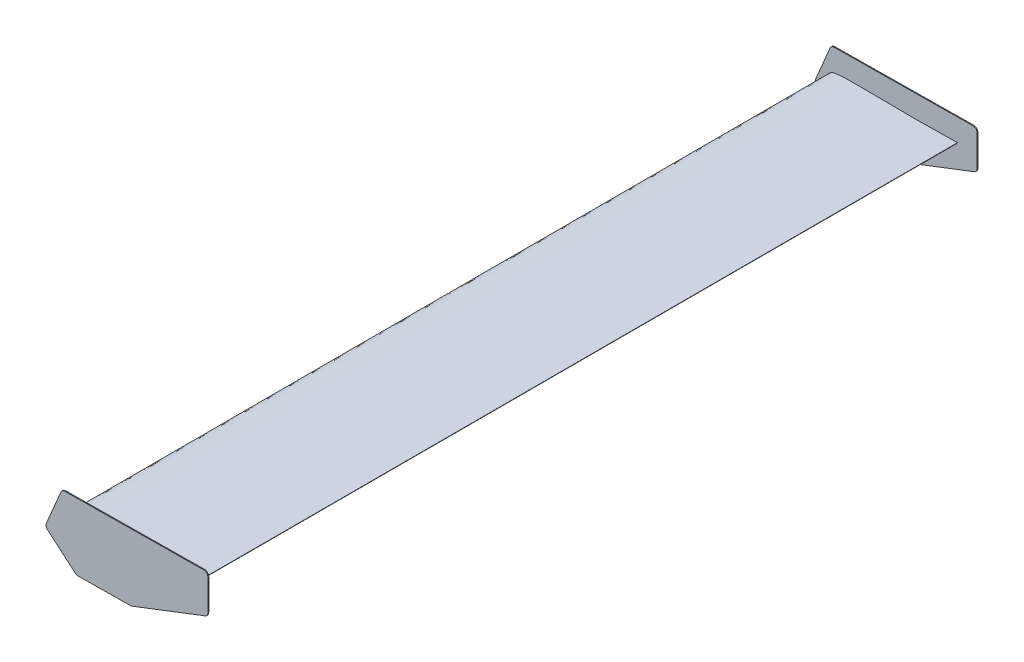
ISO-10303-21;
HEADER;
FILE_DESCRIPTION(('STEP AP214'),'2;1');
FILE_NAME('part.step','',(''),(''),'','','');
FILE_SCHEMA(('AUTOMOTIVE_DESIGN { 1 0 10303 214 1 1 1 1 }'));
ENDSEC;
DATA;
#1=APPLICATION_CONTEXT('core data for automotive mechanical design processes');
#2=APPLICATION_PROTOCOL_DEFINITION('international standard','automotive_design',2000,#1);
#3=PRODUCT_CONTEXT('',#1,'mechanical');
#4=PRODUCT('Part','Part','',(#3));
#5=PRODUCT_RELATED_PRODUCT_CATEGORY('part','',(#4));
#6=PRODUCT_DEFINITION_FORMATION('','',#4);
#7=PRODUCT_DEFINITION_CONTEXT('part definition',#1,'design');
#8=PRODUCT_DEFINITION('design','',#6,#7);
#9=PRODUCT_DEFINITION_SHAPE('','',#8);
#10=(LENGTH_UNIT() NAMED_UNIT(*) SI_UNIT(.MILLI.,.METRE.));
#11=(NAMED_UNIT(*) PLANE_ANGLE_UNIT() SI_UNIT($,.RADIAN.));
#12=(NAMED_UNIT(*) SI_UNIT($,.STERADIAN.) SOLID_ANGLE_UNIT());
#13=UNCERTAINTY_MEASURE_WITH_UNIT(LENGTH_MEASURE(1.E-05),#10,'distance_accuracy_value','');
#14=(GEOMETRIC_REPRESENTATION_CONTEXT(3) GLOBAL_UNCERTAINTY_ASSIGNED_CONTEXT((#13)) GLOBAL_UNIT_ASSIGNED_CONTEXT((#10,
#11,#12)) REPRESENTATION_CONTEXT('',''));
#15=CARTESIAN_POINT('',(0.,0.,0.));
#16=DIRECTION('',(0.,0.,1.));
#17=DIRECTION('',(1.,0.,0.));
#18=AXIS2_PLACEMENT_3D('',#15,#16,#17);
#19=CARTESIAN_POINT('',(0.,0.,899.));
#20=DIRECTION('',(0.,0.,-1.));
#21=DIRECTION('',(-1.,0.,0.));
#22=AXIS2_PLACEMENT_3D('',#19,#20,#21);
#23=PLANE('',#22);
#24=DIRECTION('',(-0.999947428083981,-0.0102538318804609,0.));
#25=VECTOR('',#24,1.);
#26=CARTESIAN_POINT('',(4.19836461655942,59.4066569608688,899.));
#27=LINE('',#26,#25);
#28=CARTESIAN_POINT('',(335.564783335885,62.8046111462092,899.));
#29=VERTEX_POINT('',#28);
#30=CARTESIAN_POINT('',(10.7496298097369,59.4738360644981,899.));
#31=VERTEX_POINT('',#30);
#32=EDGE_CURVE('E235',#29,#31,#27,.T.);
#33=ORIENTED_EDGE('',*,*,#32,.F.);
#34=CARTESIAN_POINT('',(335.667321654689,52.8051368653694,899.));
#35=DIRECTION('',(0.,0.,-1.));
#36=DIRECTION('',(-1.,0.,0.));
#37=AXIS2_PLACEMENT_3D('',#34,#35,#36);
#38=CIRCLE('',#37,10.);
#39=CARTESIAN_POINT('',(345.667321654689,52.8051368653694,899.));
#40=VERTEX_POINT('',#39);
#41=EDGE_CURVE('E262',#29,#40,#38,.T.);
#42=ORIENTED_EDGE('',*,*,#41,.T.);
#43=DIRECTION('',(0.,1.,0.));
#44=VECTOR('',#43,1.);
#45=CARTESIAN_POINT('',(345.667321654689,62.908206321893,899.));
#46=LINE('',#45,#44);
#47=CARTESIAN_POINT('',(345.667321654689,-19.4543841415105,899.));
#48=VERTEX_POINT('',#47);
#49=EDGE_CURVE('E380',#48,#40,#46,.T.);
#50=ORIENTED_EDGE('',*,*,#49,.F.);
#51=CARTESIAN_POINT('',(335.667321654689,-19.4543841415105,899.));
#52=DIRECTION('',(0.,0.,-1.));
#53=DIRECTION('',(-1.,0.,0.));
#54=AXIS2_PLACEMENT_3D('',#51,#52,#53);
#55=CIRCLE('',#54,10.);
#56=CARTESIAN_POINT('',(339.261892028957,-28.7860004979859,899.));
#57=VERTEX_POINT('',#56);
#58=EDGE_CURVE('E260',#48,#57,#55,.T.);
#59=ORIENTED_EDGE('',*,*,#58,.T.);
#60=DIRECTION('',(0.93316163564754,0.35945703742674,0.));
#61=VECTOR('',#60,1.);
#62=CARTESIAN_POINT('',(166.275090380422,-95.4211051348804,899.));
#63=LINE('',#62,#61);
#64=CARTESIAN_POINT('',(167.960784377593,-94.7717700710672,899.));
#65=VERTEX_POINT('',#64);
#66=EDGE_CURVE('E406',#65,#57,#63,.T.);
#67=ORIENTED_EDGE('',*,*,#66,.F.);
#68=CARTESIAN_POINT('',(164.366214003326,-85.4401537145918,899.));
#69=DIRECTION('',(0.,0.,-1.));
#70=DIRECTION('',(-1.,0.,0.));
#71=AXIS2_PLACEMENT_3D('',#68,#69,#70);
#72=CIRCLE('',#71,10.);
#73=CARTESIAN_POINT('',(164.46875232213,-95.4396279954316,899.));
#74=VERTEX_POINT('',#73);
#75=EDGE_CURVE('E258',#65,#74,#72,.T.);
#76=ORIENTED_EDGE('',*,*,#75,.T.);
#77=DIRECTION('',(0.99994742808398,0.010253831880461,0.));
#78=VECTOR('',#77,1.);
#79=CARTESIAN_POINT('',(38.2575012573376,-96.7338449847395,899.));
#80=LINE('',#79,#78);
#81=CARTESIAN_POINT('',(42.0078617050286,-96.6953873974287,899.));
#82=VERTEX_POINT('',#81);
#83=EDGE_CURVE('E403',#82,#74,#80,.T.);
#84=ORIENTED_EDGE('',*,*,#83,.F.);
#85=CARTESIAN_POINT('',(41.905323386224,-86.6959131165889,899.));
#86=DIRECTION('',(0.,0.,-1.));
#87=DIRECTION('',(-1.,0.,0.));
#88=AXIS2_PLACEMENT_3D('',#85,#86,#87);
#89=CIRCLE('',#88,10.);
#90=CARTESIAN_POINT('',(35.4068383285812,-94.2965507185006,899.));
#91=VERTEX_POINT('',#90);
#92=EDGE_CURVE('E252',#82,#91,#89,.T.);
#93=ORIENTED_EDGE('',*,*,#92,.T.);
#94=DIRECTION('',(0.760063760191166,-0.649848505764278,0.));
#95=VECTOR('',#94,1.);
#96=CARTESIAN_POINT('',(-35.2909208199958,-33.8505255955157,899.));
#97=LINE('',#96,#95);
#98=CARTESIAN_POINT('',(-29.7260776200808,-38.6084225348037,899.));
#99=VERTEX_POINT('',#98);
#100=EDGE_CURVE('E400',#99,#91,#97,.T.);
#101=ORIENTED_EDGE('',*,*,#100,.F.);
#102=CARTESIAN_POINT('',(-23.227592562438,-31.007784932892,899.));
#103=DIRECTION('',(0.,0.,-1.));
#104=DIRECTION('',(-1.,0.,0.));
#105=AXIS2_PLACEMENT_3D('',#102,#103,#104);
#106=CIRCLE('',#105,10.);
#107=CARTESIAN_POINT('',(-32.4360484248066,-27.1085105605493,899.));
#108=VERTEX_POINT('',#107);
#109=EDGE_CURVE('E254',#99,#108,#106,.T.);
#110=ORIENTED_EDGE('',*,*,#109,.T.);
#111=DIRECTION('',(-0.38992743723427,-0.920845586236864,0.));
#112=VECTOR('',#111,1.);
#113=CARTESIAN_POINT('',(4.19836461655942,59.4066569608688,899.));
#114=LINE('',#113,#112);
#115=CARTESIAN_POINT('',(1.64371226617284,53.373636156001,899.));
#116=VERTEX_POINT('',#115);
#117=EDGE_CURVE('E397',#116,#108,#114,.T.);
#118=ORIENTED_EDGE('',*,*,#117,.F.);
#119=CARTESIAN_POINT('',(10.8521681285415,49.4743617836583,899.));
#120=DIRECTION('',(0.,0.,-1.));
#121=DIRECTION('',(-1.,0.,0.));
#122=AXIS2_PLACEMENT_3D('',#119,#120,#121);
#123=CIRCLE('',#122,10.);
#124=EDGE_CURVE('E256',#116,#31,#123,.T.);
#125=ORIENTED_EDGE('',*,*,#124,.T.);
#126=EDGE_LOOP('',(#33,#42,#50,#59,#67,#76,#84,#93,#101,#110,#118,#125));
#127=FACE_BOUND('',#126,.T.);
#128=CARTESIAN_POINT('',(299.817501451196,10.4698578577689,899.));
#129=CARTESIAN_POINT('',(294.819493558829,10.3247333266549,899.));
#130=CARTESIAN_POINT('',(284.823207898669,10.034476428196,899.));
#131=CARTESIAN_POINT('',(264.825396651254,9.62450241999933,899.));
#132=CARTESIAN_POINT('',(239.823941693245,9.18232731185009,899.));
#133=CARTESIAN_POINT('',(209.813246030922,8.95797250689968,899.));
#134=CARTESIAN_POINT('',(179.795480369291,9.01543988824321,899.));
#135=CARTESIAN_POINT('',(149.774348493225,9.25845621632941,899.));
#136=CARTESIAN_POINT('',(119.747764534315,9.37676564731784,899.));
#137=CARTESIAN_POINT('',(94.7257174089398,9.73657753304946,899.));
#138=CARTESIAN_POINT('',(74.7055026848703,9.99943048883228,899.));
#139=CARTESIAN_POINT('',(59.694314486879,10.2946297974344,899.));
#140=CARTESIAN_POINT('',(44.6852995562319,10.210119951843,899.));
#141=CARTESIAN_POINT('',(32.1838960242226,9.82488500204351,899.));
#142=CARTESIAN_POINT('',(22.1933600200283,9.02102063681778,899.));
#143=CARTESIAN_POINT('',(14.6887107150029,8.107455225593,899.));
#144=CARTESIAN_POINT('',(8.35908343666014,6.59405140068495,899.));
#145=CARTESIAN_POINT('',(3.07226363202046,4.48936231611118,899.));
#146=CARTESIAN_POINT('',(-2.00742192700509,-0.590375041487433,899.));
#147=CARTESIAN_POINT('',(3.06702174071527,-6.83857075672109,899.));
#148=CARTESIAN_POINT('',(8.78272888026005,-10.6374153518176,899.));
#149=CARTESIAN_POINT('',(15.325277330079,-13.7539263589575,899.));
#150=CARTESIAN_POINT('',(22.9653244495639,-16.5821851820806,899.));
#151=CARTESIAN_POINT('',(33.070045823256,-19.5104386047602,899.));
#152=CARTESIAN_POINT('',(45.6513409483603,-22.3232088429504,899.));
#153=CARTESIAN_POINT('',(60.7931768513638,-24.5046816970978,899.));
#154=CARTESIAN_POINT('',(75.8734683843432,-25.8221406714379,899.));
#155=CARTESIAN_POINT('',(95.9183287044872,-26.5333635126473,899.));
#156=CARTESIAN_POINT('',(120.964329455509,-25.6715114345032,899.));
#157=CARTESIAN_POINT('',(150.901265807137,-22.7048522321919,899.));
#158=CARTESIAN_POINT('',(180.801099732482,-18.5567332890766,899.));
#159=CARTESIAN_POINT('',(210.641802762297,-13.1473547867284,899.));
#160=CARTESIAN_POINT('',(240.473223162505,-6.76904160970051,899.));
#161=CARTESIAN_POINT('',(265.241620881106,-0.483296224805891,899.));
#162=CARTESIAN_POINT('',(285.028566090619,5.11735656510686,899.));
#163=CARTESIAN_POINT('',(294.897371675381,8.16352838072202,899.));
#164=CARTESIAN_POINT('',(299.84370965418,9.69029828333194,899.));
#165=B_SPLINE_CURVE_WITH_KNOTS('',3,(#128,#129,#130,#131,#132,#133,#134,#135,#136,#137,#138,
#139,#140,#141,#142,#143,#144,#145,#146,#147,#148,#149,#150,#151,#152,#153,#154,#155,#156,#157,
#158,#159,#160,#161,#162,#163,#164),.UNSPECIFIED.,.F.,.F.,(4,1,1,1,1,1,1,1,1,1,1,1,1,1,1,1,1,1,
1,1,1,1,1,1,1,1,1,1,1,1,1,1,1,1,4),(0.,0.0244427721061945,0.0488868640389345,0.0977785916589877,
0.146679776180424,0.195594373169575,0.244518129566772,0.293441885963969,0.342378242904188,
0.366848716418896,0.391319189933605,0.415771101598765,0.440213629284816,0.45244886604217,
0.464730985941134,0.477233997408243,0.483852229950494,0.493136970824156,0.506538949171679,
0.514213997148271,0.528080018214651,0.541297784208939,0.554174880744231,0.579429854643616,
0.604273702829676,0.628897262955146,0.653399405638713,0.702284461010814,0.751259990775971,
0.800413393105454,0.849809284276661,0.899479567348494,0.949512346609459,0.974695114289043,1.),.UNSPECIFIED.);
#166=CARTESIAN_POINT('',(299.84370965418,9.69029828333194,899.));
#167=VERTEX_POINT('',#166);
#168=CARTESIAN_POINT('',(299.817501451196,10.4698578577689,899.));
#169=VERTEX_POINT('',#168);
#170=EDGE_CURVE('E244',#167,#169,#165,.F.);
#171=ORIENTED_EDGE('',*,*,#170,.F.);
#172=DIRECTION('',(0.0336002602352447,-0.999435351842291,0.));
#173=VECTOR('',#172,1.);
#174=CARTESIAN_POINT('',(299.817501451196,10.4698578577689,899.));
#175=LINE('',#174,#173);
#176=EDGE_CURVE('E240',#169,#167,#175,.T.);
#177=ORIENTED_EDGE('',*,*,#176,.F.);
#178=EDGE_LOOP('',(#171,#177));
#179=FACE_BOUND('',#178,.T.);
#180=ADVANCED_FACE('F45',(#127,#179),#23,.T.);
#181=CARTESIAN_POINT('',(4.19836461655942,59.4066569608688,901.));
#182=DIRECTION('',(0.0102538318804609,-0.999947428083981,0.));
#183=DIRECTION('',(0.999947428083981,0.0102538318804609,0.));
#184=AXIS2_PLACEMENT_3D('',#181,#182,#183);
#185=PLANE('',#184);
#186=DIRECTION('',(-0.999947428083981,-0.0102538318804609,0.));
#187=VECTOR('',#186,1.);
#188=CARTESIAN_POINT('',(4.19836461655942,59.4066569608688,901.));
#189=LINE('',#188,#187);
#190=CARTESIAN_POINT('',(335.564783335885,62.8046111462092,901.));
#191=VERTEX_POINT('',#190);
#192=CARTESIAN_POINT('',(10.7496298097369,59.4738360644981,901.));
#193=VERTEX_POINT('',#192);
#194=EDGE_CURVE('E373',#191,#193,#189,.T.);
#195=ORIENTED_EDGE('',*,*,#194,.F.);
#196=DIRECTION('',(0.,0.,-1.));
#197=VECTOR('',#196,1.);
#198=CARTESIAN_POINT('',(335.564783335885,62.8046111462092,901.));
#199=LINE('',#198,#197);
#200=EDGE_CURVE('E249',#191,#29,#199,.T.);
#201=ORIENTED_EDGE('',*,*,#200,.T.);
#202=ORIENTED_EDGE('',*,*,#32,.T.);
#203=DIRECTION('',(0.,0.,-1.));
#204=VECTOR('',#203,1.);
#205=CARTESIAN_POINT('',(10.7496298097369,59.4738360644981,901.));
#206=LINE('',#205,#204);
#207=EDGE_CURVE('E242',#31,#193,#206,.F.);
#208=ORIENTED_EDGE('',*,*,#207,.T.);
#209=EDGE_LOOP('',(#195,#201,#202,#208));
#210=FACE_BOUND('',#209,.T.);
#211=ADVANCED_FACE('F475',(#210),#185,.F.);
#212=CARTESIAN_POINT('',(4.19836461655942,59.4066569608688,901.));
#213=DIRECTION('',(0.920845586236864,-0.38992743723427,0.));
#214=DIRECTION('',(0.38992743723427,0.920845586236864,0.));
#215=AXIS2_PLACEMENT_3D('',#212,#213,#214);
#216=PLANE('',#215);
#217=DIRECTION('',(-0.38992743723427,-0.920845586236864,0.));
#218=VECTOR('',#217,1.);
#219=CARTESIAN_POINT('',(4.19836461655942,59.4066569608688,901.));
#220=LINE('',#219,#218);
#221=CARTESIAN_POINT('',(1.64371226617284,53.373636156001,901.));
#222=VERTEX_POINT('',#221);
#223=CARTESIAN_POINT('',(-32.4360484248066,-27.1085105605493,901.));
#224=VERTEX_POINT('',#223);
#225=EDGE_CURVE('E379',#222,#224,#220,.T.);
#226=ORIENTED_EDGE('',*,*,#225,.F.);
#227=DIRECTION('',(0.,0.,-1.));
#228=VECTOR('',#227,1.);
#229=CARTESIAN_POINT('',(1.64371226617284,53.373636156001,901.));
#230=LINE('',#229,#228);
#231=EDGE_CURVE('E293',#222,#116,#230,.T.);
#232=ORIENTED_EDGE('',*,*,#231,.T.);
#233=ORIENTED_EDGE('',*,*,#117,.T.);
#234=DIRECTION('',(0.,0.,-1.));
#235=VECTOR('',#234,1.);
#236=CARTESIAN_POINT('',(-32.4360484248066,-27.1085105605493,901.));
#237=LINE('',#236,#235);
#238=EDGE_CURVE('E291',#108,#224,#237,.F.);
#239=ORIENTED_EDGE('',*,*,#238,.T.);
#240=EDGE_LOOP('',(#226,#232,#233,#239));
#241=FACE_BOUND('',#240,.T.);
#242=ADVANCED_FACE('F481',(#241),#216,.F.);
#243=CARTESIAN_POINT('',(-35.2909208199958,-33.8505255955157,901.));
#244=DIRECTION('',(0.649848505764278,0.760063760191167,0.));
#245=DIRECTION('',(-0.760063760191167,0.649848505764278,0.));
#246=AXIS2_PLACEMENT_3D('',#243,#244,#245);
#247=PLANE('',#246);
#248=DIRECTION('',(0.760063760191166,-0.649848505764278,0.));
#249=VECTOR('',#248,1.);
#250=CARTESIAN_POINT('',(-35.2909208199958,-33.8505255955157,901.));
#251=LINE('',#250,#249);
#252=CARTESIAN_POINT('',(-29.7260776200808,-38.6084225348037,901.));
#253=VERTEX_POINT('',#252);
#254=CARTESIAN_POINT('',(35.4068383285812,-94.2965507185006,901.));
#255=VERTEX_POINT('',#254);
#256=EDGE_CURVE('E383',#253,#255,#251,.T.);
#257=ORIENTED_EDGE('',*,*,#256,.F.);
#258=DIRECTION('',(0.,0.,-1.));
#259=VECTOR('',#258,1.);
#260=CARTESIAN_POINT('',(-29.7260776200808,-38.6084225348037,901.));
#261=LINE('',#260,#259);
#262=EDGE_CURVE('E227',#253,#99,#261,.T.);
#263=ORIENTED_EDGE('',*,*,#262,.T.);
#264=ORIENTED_EDGE('',*,*,#100,.T.);
#265=DIRECTION('',(0.,0.,-1.));
#266=VECTOR('',#265,1.);
#267=CARTESIAN_POINT('',(35.4068383285812,-94.2965507185006,901.));
#268=LINE('',#267,#266);
#269=EDGE_CURVE('E296',#91,#255,#268,.F.);
#270=ORIENTED_EDGE('',*,*,#269,.T.);
#271=EDGE_LOOP('',(#257,#263,#264,#270));
#272=FACE_BOUND('',#271,.T.);
#273=ADVANCED_FACE('F499',(#272),#247,.F.);
#274=CARTESIAN_POINT('',(38.2575012573376,-96.7338449847395,901.));
#275=DIRECTION('',(-0.010253831880461,0.999947428083981,0.));
#276=DIRECTION('',(-0.999947428083981,-0.010253831880461,0.));
#277=AXIS2_PLACEMENT_3D('',#274,#275,#276);
#278=PLANE('',#277);
#279=ORIENTED_EDGE('',*,*,#83,.T.);
#280=DIRECTION('',(0.,0.,-1.));
#281=VECTOR('',#280,1.);
#282=CARTESIAN_POINT('',(164.46875232213,-95.4396279954316,901.));
#283=LINE('',#282,#281);
#284=CARTESIAN_POINT('',(164.46875232213,-95.4396279954316,901.));
#285=VERTEX_POINT('',#284);
#286=EDGE_CURVE('E289',#74,#285,#283,.F.);
#287=ORIENTED_EDGE('',*,*,#286,.T.);
#288=DIRECTION('',(0.99994742808398,0.010253831880461,0.));
#289=VECTOR('',#288,1.);
#290=CARTESIAN_POINT('',(38.2575012573376,-96.7338449847395,901.));
#291=LINE('',#290,#289);
#292=CARTESIAN_POINT('',(42.0078617050286,-96.6953873974287,901.));
#293=VERTEX_POINT('',#292);
#294=EDGE_CURVE('E386',#293,#285,#291,.T.);
#295=ORIENTED_EDGE('',*,*,#294,.F.);
#296=DIRECTION('',(0.,0.,-1.));
#297=VECTOR('',#296,1.);
#298=CARTESIAN_POINT('',(42.0078617050286,-96.6953873974287,901.));
#299=LINE('',#298,#297);
#300=EDGE_CURVE('E286',#293,#82,#299,.T.);
#301=ORIENTED_EDGE('',*,*,#300,.T.);
#302=EDGE_LOOP('',(#279,#287,#295,#301));
#303=FACE_BOUND('',#302,.T.);
#304=ADVANCED_FACE('F495',(#303),#278,.F.);
#305=CARTESIAN_POINT('',(166.275090380422,-95.4211051348804,901.));
#306=DIRECTION('',(-0.359457037426739,0.93316163564754,0.));
#307=DIRECTION('',(-0.93316163564754,-0.35945703742674,0.));
#308=AXIS2_PLACEMENT_3D('',#305,#306,#307);
#309=PLANE('',#308);
#310=ORIENTED_EDGE('',*,*,#66,.T.);
#311=DIRECTION('',(0.,0.,-1.));
#312=VECTOR('',#311,1.);
#313=CARTESIAN_POINT('',(339.261892028957,-28.7860004979859,901.));
#314=LINE('',#313,#312);
#315=CARTESIAN_POINT('',(339.261892028957,-28.7860004979859,901.));
#316=VERTEX_POINT('',#315);
#317=EDGE_CURVE('E284',#57,#316,#314,.F.);
#318=ORIENTED_EDGE('',*,*,#317,.T.);
#319=DIRECTION('',(0.93316163564754,0.35945703742674,0.));
#320=VECTOR('',#319,1.);
#321=CARTESIAN_POINT('',(166.275090380422,-95.4211051348804,901.));
#322=LINE('',#321,#320);
#323=CARTESIAN_POINT('',(167.960784377593,-94.7717700710672,901.));
#324=VERTEX_POINT('',#323);
#325=EDGE_CURVE('E389',#324,#316,#322,.T.);
#326=ORIENTED_EDGE('',*,*,#325,.F.);
#327=DIRECTION('',(0.,0.,-1.));
#328=VECTOR('',#327,1.);
#329=CARTESIAN_POINT('',(167.960784377593,-94.7717700710672,901.));
#330=LINE('',#329,#328);
#331=EDGE_CURVE('E281',#324,#65,#330,.T.);
#332=ORIENTED_EDGE('',*,*,#331,.T.);
#333=EDGE_LOOP('',(#310,#318,#326,#332));
#334=FACE_BOUND('',#333,.T.);
#335=ADVANCED_FACE('F491',(#334),#309,.F.);
#336=CARTESIAN_POINT('',(345.667321654689,62.908206321893,901.));
#337=DIRECTION('',(-1.,0.,0.));
#338=DIRECTION('',(0.,0.,1.));
#339=AXIS2_PLACEMENT_3D('',#336,#337,#338);
#340=PLANE('',#339);
#341=ORIENTED_EDGE('',*,*,#49,.T.);
#342=DIRECTION('',(0.,0.,-1.));
#343=VECTOR('',#342,1.);
#344=CARTESIAN_POINT('',(345.667321654689,52.8051368653694,901.));
#345=LINE('',#344,#343);
#346=CARTESIAN_POINT('',(345.667321654689,52.8051368653694,901.));
#347=VERTEX_POINT('',#346);
#348=EDGE_CURVE('E267',#40,#347,#345,.F.);
#349=ORIENTED_EDGE('',*,*,#348,.T.);
#350=DIRECTION('',(0.,1.,0.));
#351=VECTOR('',#350,1.);
#352=CARTESIAN_POINT('',(345.667321654689,62.908206321893,901.));
#353=LINE('',#352,#351);
#354=CARTESIAN_POINT('',(345.667321654689,-19.4543841415105,901.));
#355=VERTEX_POINT('',#354);
#356=EDGE_CURVE('E392',#355,#347,#353,.T.);
#357=ORIENTED_EDGE('',*,*,#356,.F.);
#358=DIRECTION('',(0.,0.,-1.));
#359=VECTOR('',#358,1.);
#360=CARTESIAN_POINT('',(345.667321654689,-19.4543841415105,901.));
#361=LINE('',#360,#359);
#362=EDGE_CURVE('E264',#355,#48,#361,.T.);
#363=ORIENTED_EDGE('',*,*,#362,.T.);
#364=EDGE_LOOP('',(#341,#349,#357,#363));
#365=FACE_BOUND('',#364,.T.);
#366=ADVANCED_FACE('F488',(#365),#340,.F.);
#367=CARTESIAN_POINT('',(0.,0.,901.));
#368=DIRECTION('',(0.,0.,-1.));
#369=DIRECTION('',(-1.,0.,0.));
#370=AXIS2_PLACEMENT_3D('',#367,#368,#369);
#371=PLANE('',#370);
#372=ORIENTED_EDGE('',*,*,#356,.T.);
#373=CARTESIAN_POINT('',(335.667321654689,52.8051368653694,901.));
#374=DIRECTION('',(0.,0.,-1.));
#375=DIRECTION('',(-1.,0.,0.));
#376=AXIS2_PLACEMENT_3D('',#373,#374,#375);
#377=CIRCLE('',#376,10.);
#378=EDGE_CURVE('E279',#347,#191,#377,.F.);
#379=ORIENTED_EDGE('',*,*,#378,.T.);
#380=ORIENTED_EDGE('',*,*,#194,.T.);
#381=CARTESIAN_POINT('',(10.8521681285415,49.4743617836583,901.));
#382=DIRECTION('',(0.,0.,-1.));
#383=DIRECTION('',(-1.,0.,0.));
#384=AXIS2_PLACEMENT_3D('',#381,#382,#383);
#385=CIRCLE('',#384,10.);
#386=EDGE_CURVE('E273',#193,#222,#385,.F.);
#387=ORIENTED_EDGE('',*,*,#386,.T.);
#388=ORIENTED_EDGE('',*,*,#225,.T.);
#389=CARTESIAN_POINT('',(-23.227592562438,-31.007784932892,901.));
#390=DIRECTION('',(0.,0.,-1.));
#391=DIRECTION('',(-1.,0.,0.));
#392=AXIS2_PLACEMENT_3D('',#389,#390,#391);
#393=CIRCLE('',#392,10.);
#394=EDGE_CURVE('E271',#224,#253,#393,.F.);
#395=ORIENTED_EDGE('',*,*,#394,.T.);
#396=ORIENTED_EDGE('',*,*,#256,.T.);
#397=CARTESIAN_POINT('',(41.905323386224,-86.6959131165889,901.));
#398=DIRECTION('',(0.,0.,-1.));
#399=DIRECTION('',(-1.,0.,0.));
#400=AXIS2_PLACEMENT_3D('',#397,#398,#399);
#401=CIRCLE('',#400,10.);
#402=EDGE_CURVE('E269',#255,#293,#401,.F.);
#403=ORIENTED_EDGE('',*,*,#402,.T.);
#404=ORIENTED_EDGE('',*,*,#294,.T.);
#405=CARTESIAN_POINT('',(164.366214003326,-85.4401537145918,901.));
#406=DIRECTION('',(0.,0.,-1.));
#407=DIRECTION('',(-1.,0.,0.));
#408=AXIS2_PLACEMENT_3D('',#405,#406,#407);
#409=CIRCLE('',#408,10.);
#410=EDGE_CURVE('E275',#285,#324,#409,.F.);
#411=ORIENTED_EDGE('',*,*,#410,.T.);
#412=ORIENTED_EDGE('',*,*,#325,.T.);
#413=CARTESIAN_POINT('',(335.667321654689,-19.4543841415105,901.));
#414=DIRECTION('',(0.,0.,-1.));
#415=DIRECTION('',(-1.,0.,0.));
#416=AXIS2_PLACEMENT_3D('',#413,#414,#415);
#417=CIRCLE('',#416,10.);
#418=EDGE_CURVE('E277',#316,#355,#417,.F.);
#419=ORIENTED_EDGE('',*,*,#418,.T.);
#420=EDGE_LOOP('',(#372,#379,#380,#387,#388,#395,#396,#403,#404,#411,#412,#419));
#421=FACE_BOUND('',#420,.T.);
#422=ADVANCED_FACE('F426',(#421),#371,.F.);
#423=CARTESIAN_POINT('',(299.817501451196,10.4698578577689,900.));
#424=CARTESIAN_POINT('',(294.819493558829,10.3247333266549,900.));
#425=CARTESIAN_POINT('',(284.823207898669,10.034476428196,900.));
#426=CARTESIAN_POINT('',(264.825396651254,9.62450241999933,900.));
#427=CARTESIAN_POINT('',(239.823941693245,9.18232731185009,900.));
#428=CARTESIAN_POINT('',(209.813246030922,8.95797250689968,900.));
#429=CARTESIAN_POINT('',(179.795480369291,9.01543988824321,900.));
#430=CARTESIAN_POINT('',(149.774348493225,9.25845621632941,900.));
#431=CARTESIAN_POINT('',(119.747764534315,9.37676564731784,900.));
#432=CARTESIAN_POINT('',(94.7257174089398,9.73657753304946,900.));
#433=CARTESIAN_POINT('',(74.7055026848703,9.99943048883228,900.));
#434=CARTESIAN_POINT('',(59.694314486879,10.2946297974344,900.));
#435=CARTESIAN_POINT('',(44.6852995562319,10.210119951843,900.));
#436=CARTESIAN_POINT('',(32.1838960242226,9.82488500204351,900.));
#437=CARTESIAN_POINT('',(22.1933600200283,9.02102063681778,900.));
#438=CARTESIAN_POINT('',(14.6887107150029,8.107455225593,900.));
#439=CARTESIAN_POINT('',(8.35908343666014,6.59405140068495,900.));
#440=CARTESIAN_POINT('',(3.07226363202046,4.48936231611118,900.));
#441=CARTESIAN_POINT('',(-2.00742192700509,-0.590375041487433,900.));
#442=CARTESIAN_POINT('',(3.06702174071527,-6.83857075672109,900.));
#443=CARTESIAN_POINT('',(8.78272888026005,-10.6374153518176,900.));
#444=CARTESIAN_POINT('',(15.325277330079,-13.7539263589575,900.));
#445=CARTESIAN_POINT('',(22.9653244495639,-16.5821851820806,900.));
#446=CARTESIAN_POINT('',(33.070045823256,-19.5104386047602,900.));
#447=CARTESIAN_POINT('',(45.6513409483603,-22.3232088429504,900.));
#448=CARTESIAN_POINT('',(60.7931768513638,-24.5046816970978,900.));
#449=CARTESIAN_POINT('',(75.8734683843432,-25.8221406714379,900.));
#450=CARTESIAN_POINT('',(95.9183287044872,-26.5333635126473,900.));
#451=CARTESIAN_POINT('',(120.964329455509,-25.6715114345032,900.));
#452=CARTESIAN_POINT('',(150.901265807137,-22.7048522321919,900.));
#453=CARTESIAN_POINT('',(180.801099732482,-18.5567332890766,900.));
#454=CARTESIAN_POINT('',(210.641802762297,-13.1473547867284,900.));
#455=CARTESIAN_POINT('',(240.473223162505,-6.76904160970051,900.));
#456=CARTESIAN_POINT('',(265.241620881106,-0.483296224805891,900.));
#457=CARTESIAN_POINT('',(285.028566090619,5.11735656510686,900.));
#458=CARTESIAN_POINT('',(294.897371675381,8.16352838072202,900.));
#459=CARTESIAN_POINT('',(299.84370965418,9.69029828333194,900.));
#460=B_SPLINE_CURVE_WITH_KNOTS('',3,(#423,#424,#425,#426,#427,#428,#429,#430,#431,#432,#433,
#434,#435,#436,#437,#438,#439,#440,#441,#442,#443,#444,#445,#446,#447,#448,#449,#450,#451,#452,
#453,#454,#455,#456,#457,#458,#459),.UNSPECIFIED.,.F.,.F.,(4,1,1,1,1,1,1,1,1,1,1,1,1,1,1,1,1,1,
1,1,1,1,1,1,1,1,1,1,1,1,1,1,1,1,4),(0.,0.0244427721061945,0.0488868640389345,0.0977785916589877,
0.146679776180424,0.195594373169575,0.244518129566772,0.293441885963969,0.342378242904188,
0.366848716418896,0.391319189933605,0.415771101598765,0.440213629284816,0.45244886604217,
0.464730985941134,0.477233997408243,0.483852229950494,0.493136970824156,0.506538949171679,
0.514213997148271,0.528080018214651,0.541297784208939,0.554174880744231,0.579429854643616,
0.604273702829676,0.628897262955146,0.653399405638713,0.702284461010814,0.751259990775971,
0.800413393105454,0.849809284276661,0.899479567348494,0.949512346609459,0.974695114289043,1.),.UNSPECIFIED.);
#461=DIRECTION('',(0.,0.,-1.));
#462=VECTOR('',#461,1.);
#463=SURFACE_OF_LINEAR_EXTRUSION('',#460,#462);
#464=DIRECTION('',(0.,0.,-1.));
#465=VECTOR('',#464,1.);
#466=CARTESIAN_POINT('',(299.817501451196,10.4698578577689,900.));
#467=LINE('',#466,#465);
#468=CARTESIAN_POINT('',(299.817501451196,10.4698578577689,-899.));
#469=VERTEX_POINT('',#468);
#470=EDGE_CURVE('E234',#169,#469,#467,.T.);
#471=ORIENTED_EDGE('',*,*,#470,.T.);
#472=CARTESIAN_POINT('',(299.817501451196,10.4698578577689,-899.));
#473=CARTESIAN_POINT('',(294.819493558829,10.3247333266549,-899.));
#474=CARTESIAN_POINT('',(284.823207898669,10.034476428196,-899.));
#475=CARTESIAN_POINT('',(264.825396651254,9.62450241999933,-899.));
#476=CARTESIAN_POINT('',(239.823941693245,9.18232731185009,-899.));
#477=CARTESIAN_POINT('',(209.813246030922,8.95797250689968,-899.));
#478=CARTESIAN_POINT('',(179.795480369291,9.01543988824321,-899.));
#479=CARTESIAN_POINT('',(149.774348493225,9.25845621632941,-899.));
#480=CARTESIAN_POINT('',(119.747764534315,9.37676564731784,-899.));
#481=CARTESIAN_POINT('',(94.7257174089398,9.73657753304946,-899.));
#482=CARTESIAN_POINT('',(74.7055026848703,9.99943048883228,-899.));
#483=CARTESIAN_POINT('',(59.694314486879,10.2946297974344,-899.));
#484=CARTESIAN_POINT('',(44.6852995562319,10.210119951843,-899.));
#485=CARTESIAN_POINT('',(32.1838960242226,9.82488500204351,-899.));
#486=CARTESIAN_POINT('',(22.1933600200283,9.02102063681778,-899.));
#487=CARTESIAN_POINT('',(14.6887107150029,8.107455225593,-899.));
#488=CARTESIAN_POINT('',(8.35908343666014,6.59405140068495,-899.));
#489=CARTESIAN_POINT('',(3.07226363202046,4.48936231611118,-899.));
#490=CARTESIAN_POINT('',(-2.00742192700509,-0.590375041487433,-899.));
#491=CARTESIAN_POINT('',(3.06702174071527,-6.83857075672109,-899.));
#492=CARTESIAN_POINT('',(8.78272888026005,-10.6374153518176,-899.));
#493=CARTESIAN_POINT('',(15.325277330079,-13.7539263589575,-899.));
#494=CARTESIAN_POINT('',(22.9653244495639,-16.5821851820806,-899.));
#495=CARTESIAN_POINT('',(33.070045823256,-19.5104386047602,-899.));
#496=CARTESIAN_POINT('',(45.6513409483603,-22.3232088429504,-899.));
#497=CARTESIAN_POINT('',(60.7931768513638,-24.5046816970978,-899.));
#498=CARTESIAN_POINT('',(75.8734683843432,-25.8221406714379,-899.));
#499=CARTESIAN_POINT('',(95.9183287044872,-26.5333635126473,-899.));
#500=CARTESIAN_POINT('',(120.964329455509,-25.6715114345032,-899.));
#501=CARTESIAN_POINT('',(150.901265807137,-22.7048522321919,-899.));
#502=CARTESIAN_POINT('',(180.801099732482,-18.5567332890766,-899.));
#503=CARTESIAN_POINT('',(210.641802762297,-13.1473547867284,-899.));
#504=CARTESIAN_POINT('',(240.473223162505,-6.76904160970051,-899.));
#505=CARTESIAN_POINT('',(265.241620881106,-0.483296224805891,-899.));
#506=CARTESIAN_POINT('',(285.028566090619,5.11735656510686,-899.));
#507=CARTESIAN_POINT('',(294.897371675381,8.16352838072202,-899.));
#508=CARTESIAN_POINT('',(299.84370965418,9.69029828333194,-899.));
#509=B_SPLINE_CURVE_WITH_KNOTS('',3,(#472,#473,#474,#475,#476,#477,#478,#479,#480,#481,#482,
#483,#484,#485,#486,#487,#488,#489,#490,#491,#492,#493,#494,#495,#496,#497,#498,#499,#500,#501,
#502,#503,#504,#505,#506,#507,#508),.UNSPECIFIED.,.F.,.F.,(4,1,1,1,1,1,1,1,1,1,1,1,1,1,1,1,1,1,
1,1,1,1,1,1,1,1,1,1,1,1,1,1,1,1,4),(0.,0.0244427721061945,0.0488868640389345,0.0977785916589877,
0.146679776180424,0.195594373169575,0.244518129566772,0.293441885963969,0.342378242904188,
0.366848716418896,0.391319189933605,0.415771101598765,0.440213629284816,0.45244886604217,
0.464730985941134,0.477233997408243,0.483852229950494,0.493136970824156,0.506538949171679,
0.514213997148271,0.528080018214651,0.541297784208939,0.554174880744231,0.579429854643616,
0.604273702829676,0.628897262955146,0.653399405638713,0.702284461010814,0.751259990775971,
0.800413393105454,0.849809284276661,0.899479567348494,0.949512346609459,0.974695114289043,1.),.UNSPECIFIED.);
#510=CARTESIAN_POINT('',(299.84370965418,9.69029828333194,-899.));
#511=VERTEX_POINT('',#510);
#512=EDGE_CURVE('E221',#469,#511,#509,.T.);
#513=ORIENTED_EDGE('',*,*,#512,.T.);
#514=DIRECTION('',(0.,0.,-1.));
#515=VECTOR('',#514,1.);
#516=CARTESIAN_POINT('',(299.84370965418,9.69029828333194,900.));
#517=LINE('',#516,#515);
#518=EDGE_CURVE('E233',#167,#511,#517,.T.);
#519=ORIENTED_EDGE('',*,*,#518,.F.);
#520=ORIENTED_EDGE('',*,*,#170,.T.);
#521=EDGE_LOOP('',(#471,#513,#519,#520));
#522=FACE_BOUND('',#521,.T.);
#523=ADVANCED_FACE('F231',(#522),#463,.F.);
#524=CARTESIAN_POINT('',(299.817501451196,10.4698578577689,900.));
#525=DIRECTION('',(-0.999435351842291,-0.0336002602352447,0.));
#526=DIRECTION('',(0.0336002602352447,-0.999435351842291,0.));
#527=AXIS2_PLACEMENT_3D('',#524,#525,#526);
#528=PLANE('',#527);
#529=ORIENTED_EDGE('',*,*,#518,.T.);
#530=DIRECTION('',(-0.0336002602352447,0.999435351842291,0.));
#531=VECTOR('',#530,1.);
#532=CARTESIAN_POINT('',(299.817501451196,10.4698578577689,-899.));
#533=LINE('',#532,#531);
#534=EDGE_CURVE('E218',#511,#469,#533,.T.);
#535=ORIENTED_EDGE('',*,*,#534,.T.);
#536=ORIENTED_EDGE('',*,*,#470,.F.);
#537=ORIENTED_EDGE('',*,*,#176,.T.);
#538=EDGE_LOOP('',(#529,#535,#536,#537));
#539=FACE_BOUND('',#538,.T.);
#540=ADVANCED_FACE('F239',(#539),#528,.F.);
#541=CARTESIAN_POINT('',(335.667321654689,52.8051368653694,901.));
#542=DIRECTION('',(0.,0.,-1.));
#543=DIRECTION('',(-1.,0.,0.));
#544=AXIS2_PLACEMENT_3D('',#541,#542,#543);
#545=CYLINDRICAL_SURFACE('',#544,10.);
#546=ORIENTED_EDGE('',*,*,#378,.F.);
#547=ORIENTED_EDGE('',*,*,#348,.F.);
#548=ORIENTED_EDGE('',*,*,#41,.F.);
#549=ORIENTED_EDGE('',*,*,#200,.F.);
#550=EDGE_LOOP('',(#546,#547,#548,#549));
#551=FACE_BOUND('',#550,.T.);
#552=ADVANCED_FACE('F428',(#551),#545,.T.);
#553=CARTESIAN_POINT('',(335.667321654689,-19.4543841415105,901.));
#554=DIRECTION('',(0.,0.,-1.));
#555=DIRECTION('',(-1.,0.,0.));
#556=AXIS2_PLACEMENT_3D('',#553,#554,#555);
#557=CYLINDRICAL_SURFACE('',#556,10.);
#558=ORIENTED_EDGE('',*,*,#418,.F.);
#559=ORIENTED_EDGE('',*,*,#317,.F.);
#560=ORIENTED_EDGE('',*,*,#58,.F.);
#561=ORIENTED_EDGE('',*,*,#362,.F.);
#562=EDGE_LOOP('',(#558,#559,#560,#561));
#563=FACE_BOUND('',#562,.T.);
#564=ADVANCED_FACE('F431',(#563),#557,.T.);
#565=CARTESIAN_POINT('',(164.366214003326,-85.4401537145918,901.));
#566=DIRECTION('',(0.,0.,-1.));
#567=DIRECTION('',(-1.,0.,0.));
#568=AXIS2_PLACEMENT_3D('',#565,#566,#567);
#569=CYLINDRICAL_SURFACE('',#568,10.);
#570=ORIENTED_EDGE('',*,*,#410,.F.);
#571=ORIENTED_EDGE('',*,*,#286,.F.);
#572=ORIENTED_EDGE('',*,*,#75,.F.);
#573=ORIENTED_EDGE('',*,*,#331,.F.);
#574=EDGE_LOOP('',(#570,#571,#572,#573));
#575=FACE_BOUND('',#574,.T.);
#576=ADVANCED_FACE('F435',(#575),#569,.T.);
#577=CARTESIAN_POINT('',(10.8521681285415,49.4743617836583,901.));
#578=DIRECTION('',(0.,0.,-1.));
#579=DIRECTION('',(-1.,0.,0.));
#580=AXIS2_PLACEMENT_3D('',#577,#578,#579);
#581=CYLINDRICAL_SURFACE('',#580,10.);
#582=ORIENTED_EDGE('',*,*,#386,.F.);
#583=ORIENTED_EDGE('',*,*,#207,.F.);
#584=ORIENTED_EDGE('',*,*,#124,.F.);
#585=ORIENTED_EDGE('',*,*,#231,.F.);
#586=EDGE_LOOP('',(#582,#583,#584,#585));
#587=FACE_BOUND('',#586,.T.);
#588=ADVANCED_FACE('F439',(#587),#581,.T.);
#589=CARTESIAN_POINT('',(-23.227592562438,-31.007784932892,901.));
#590=DIRECTION('',(0.,0.,-1.));
#591=DIRECTION('',(-1.,0.,0.));
#592=AXIS2_PLACEMENT_3D('',#589,#590,#591);
#593=CYLINDRICAL_SURFACE('',#592,10.);
#594=ORIENTED_EDGE('',*,*,#394,.F.);
#595=ORIENTED_EDGE('',*,*,#238,.F.);
#596=ORIENTED_EDGE('',*,*,#109,.F.);
#597=ORIENTED_EDGE('',*,*,#262,.F.);
#598=EDGE_LOOP('',(#594,#595,#596,#597));
#599=FACE_BOUND('',#598,.T.);
#600=ADVANCED_FACE('F443',(#599),#593,.T.);
#601=CARTESIAN_POINT('',(41.905323386224,-86.6959131165889,901.));
#602=DIRECTION('',(0.,0.,-1.));
#603=DIRECTION('',(-1.,0.,0.));
#604=AXIS2_PLACEMENT_3D('',#601,#602,#603);
#605=CYLINDRICAL_SURFACE('',#604,10.);
#606=ORIENTED_EDGE('',*,*,#402,.F.);
#607=ORIENTED_EDGE('',*,*,#269,.F.);
#608=ORIENTED_EDGE('',*,*,#92,.F.);
#609=ORIENTED_EDGE('',*,*,#300,.F.);
#610=EDGE_LOOP('',(#606,#607,#608,#609));
#611=FACE_BOUND('',#610,.T.);
#612=ADVANCED_FACE('F447',(#611),#605,.T.);
#613=CARTESIAN_POINT('',(0.,0.,-899.));
#614=DIRECTION('',(0.,0.,1.));
#615=DIRECTION('',(-1.,0.,0.));
#616=AXIS2_PLACEMENT_3D('',#613,#614,#615);
#617=PLANE('',#616);
#618=DIRECTION('',(0.,1.,0.));
#619=VECTOR('',#618,1.);
#620=CARTESIAN_POINT('',(345.667321654689,62.908206321893,-899.));
#621=LINE('',#620,#619);
#622=CARTESIAN_POINT('',(345.667321654689,-19.4543841415105,-899.));
#623=VERTEX_POINT('',#622);
#624=CARTESIAN_POINT('',(345.667321654689,52.8051368653694,-899.));
#625=VERTEX_POINT('',#624);
#626=EDGE_CURVE('E750',#623,#625,#621,.T.);
#627=ORIENTED_EDGE('',*,*,#626,.T.);
#628=CARTESIAN_POINT('',(335.667321654689,52.8051368653694,-899.));
#629=DIRECTION('',(0.,0.,1.));
#630=DIRECTION('',(1.,0.,0.));
#631=AXIS2_PLACEMENT_3D('',#628,#629,#630);
#632=CIRCLE('',#631,10.);
#633=CARTESIAN_POINT('',(335.564783335885,62.8046111462092,-899.));
#634=VERTEX_POINT('',#633);
#635=EDGE_CURVE('E314',#625,#634,#632,.T.);
#636=ORIENTED_EDGE('',*,*,#635,.T.);
#637=DIRECTION('',(-0.999947428083981,-0.0102538318804609,0.));
#638=VECTOR('',#637,1.);
#639=CARTESIAN_POINT('',(4.19836461655942,59.4066569608688,-899.));
#640=LINE('',#639,#638);
#641=CARTESIAN_POINT('',(10.7496298097369,59.4738360644981,-899.));
#642=VERTEX_POINT('',#641);
#643=EDGE_CURVE('E755',#634,#642,#640,.T.);
#644=ORIENTED_EDGE('',*,*,#643,.T.);
#645=CARTESIAN_POINT('',(10.8521681285415,49.4743617836583,-899.));
#646=DIRECTION('',(0.,0.,1.));
#647=DIRECTION('',(1.,0.,0.));
#648=AXIS2_PLACEMENT_3D('',#645,#646,#647);
#649=CIRCLE('',#648,10.);
#650=CARTESIAN_POINT('',(1.64371226617284,53.373636156001,-899.));
#651=VERTEX_POINT('',#650);
#652=EDGE_CURVE('E308',#642,#651,#649,.T.);
#653=ORIENTED_EDGE('',*,*,#652,.T.);
#654=DIRECTION('',(-0.38992743723427,-0.920845586236864,0.));
#655=VECTOR('',#654,1.);
#656=CARTESIAN_POINT('',(4.19836461655942,59.4066569608688,-899.));
#657=LINE('',#656,#655);
#658=CARTESIAN_POINT('',(-32.4360484248066,-27.1085105605493,-899.));
#659=VERTEX_POINT('',#658);
#660=EDGE_CURVE('E362',#651,#659,#657,.T.);
#661=ORIENTED_EDGE('',*,*,#660,.T.);
#662=CARTESIAN_POINT('',(-23.227592562438,-31.0077849328921,-899.));
#663=DIRECTION('',(0.,0.,1.));
#664=DIRECTION('',(1.,0.,0.));
#665=AXIS2_PLACEMENT_3D('',#662,#663,#664);
#666=CIRCLE('',#665,10.);
#667=CARTESIAN_POINT('',(-29.7260776200808,-38.6084225348037,-899.));
#668=VERTEX_POINT('',#667);
#669=EDGE_CURVE('E306',#659,#668,#666,.T.);
#670=ORIENTED_EDGE('',*,*,#669,.T.);
#671=DIRECTION('',(0.760063760191166,-0.649848505764278,0.));
#672=VECTOR('',#671,1.);
#673=CARTESIAN_POINT('',(-35.2909208199958,-33.8505255955157,-899.));
#674=LINE('',#673,#672);
#675=CARTESIAN_POINT('',(35.4068383285812,-94.2965507185006,-899.));
#676=VERTEX_POINT('',#675);
#677=EDGE_CURVE('E352',#668,#676,#674,.T.);
#678=ORIENTED_EDGE('',*,*,#677,.T.);
#679=CARTESIAN_POINT('',(41.905323386224,-86.6959131165889,-899.));
#680=DIRECTION('',(0.,0.,1.));
#681=DIRECTION('',(1.,0.,0.));
#682=AXIS2_PLACEMENT_3D('',#679,#680,#681);
#683=CIRCLE('',#682,10.);
#684=CARTESIAN_POINT('',(42.0078617050286,-96.6953873974287,-899.));
#685=VERTEX_POINT('',#684);
#686=EDGE_CURVE('E304',#676,#685,#683,.T.);
#687=ORIENTED_EDGE('',*,*,#686,.T.);
#688=DIRECTION('',(0.99994742808398,0.010253831880461,0.));
#689=VECTOR('',#688,1.);
#690=CARTESIAN_POINT('',(38.2575012573376,-96.7338449847395,-899.));
#691=LINE('',#690,#689);
#692=CARTESIAN_POINT('',(164.46875232213,-95.4396279954316,-899.));
#693=VERTEX_POINT('',#692);
#694=EDGE_CURVE('E363',#685,#693,#691,.T.);
#695=ORIENTED_EDGE('',*,*,#694,.T.);
#696=CARTESIAN_POINT('',(164.366214003326,-85.4401537145918,-899.));
#697=DIRECTION('',(0.,0.,1.));
#698=DIRECTION('',(1.,0.,0.));
#699=AXIS2_PLACEMENT_3D('',#696,#697,#698);
#700=CIRCLE('',#699,10.);
#701=CARTESIAN_POINT('',(167.960784377593,-94.7717700710672,-899.));
#702=VERTEX_POINT('',#701);
#703=EDGE_CURVE('E310',#693,#702,#700,.T.);
#704=ORIENTED_EDGE('',*,*,#703,.T.);
#705=DIRECTION('',(0.93316163564754,0.35945703742674,0.));
#706=VECTOR('',#705,1.);
#707=CARTESIAN_POINT('',(166.275090380422,-95.4211051348804,-899.));
#708=LINE('',#707,#706);
#709=CARTESIAN_POINT('',(339.261892028957,-28.7860004979859,-899.));
#710=VERTEX_POINT('',#709);
#711=EDGE_CURVE('E367',#702,#710,#708,.T.);
#712=ORIENTED_EDGE('',*,*,#711,.T.);
#713=CARTESIAN_POINT('',(335.667321654689,-19.4543841415105,-899.));
#714=DIRECTION('',(0.,0.,1.));
#715=DIRECTION('',(1.,0.,0.));
#716=AXIS2_PLACEMENT_3D('',#713,#714,#715);
#717=CIRCLE('',#716,10.);
#718=EDGE_CURVE('E312',#710,#623,#717,.T.);
#719=ORIENTED_EDGE('',*,*,#718,.T.);
#720=EDGE_LOOP('',(#627,#636,#644,#653,#661,#670,#678,#687,#695,#704,#712,#719));
#721=FACE_BOUND('',#720,.T.);
#722=ORIENTED_EDGE('',*,*,#512,.F.);
#723=ORIENTED_EDGE('',*,*,#534,.F.);
#724=EDGE_LOOP('',(#722,#723));
#725=FACE_BOUND('',#724,.T.);
#726=ADVANCED_FACE('F220',(#721,#725),#617,.T.);
#727=CARTESIAN_POINT('',(4.19836461655942,59.4066569608688,-901.));
#728=DIRECTION('',(-0.0102538318804609,0.999947428083981,0.));
#729=DIRECTION('',(-0.999947428083981,-0.0102538318804609,0.));
#730=AXIS2_PLACEMENT_3D('',#727,#728,#729);
#731=PLANE('',#730);
#732=ORIENTED_EDGE('',*,*,#643,.F.);
#733=DIRECTION('',(0.,0.,1.));
#734=VECTOR('',#733,1.);
#735=CARTESIAN_POINT('',(335.564783335885,62.8046111462092,-901.));
#736=LINE('',#735,#734);
#737=CARTESIAN_POINT('',(335.564783335885,62.8046111462092,-901.));
#738=VERTEX_POINT('',#737);
#739=EDGE_CURVE('E319',#634,#738,#736,.F.);
#740=ORIENTED_EDGE('',*,*,#739,.T.);
#741=DIRECTION('',(-0.999947428083981,-0.0102538318804609,0.));
#742=VECTOR('',#741,1.);
#743=CARTESIAN_POINT('',(4.19836461655942,59.4066569608688,-901.));
#744=LINE('',#743,#742);
#745=CARTESIAN_POINT('',(10.7496298097369,59.4738360644981,-901.));
#746=VERTEX_POINT('',#745);
#747=EDGE_CURVE('E365',#738,#746,#744,.T.);
#748=ORIENTED_EDGE('',*,*,#747,.T.);
#749=DIRECTION('',(0.,0.,1.));
#750=VECTOR('',#749,1.);
#751=CARTESIAN_POINT('',(10.7496298097369,59.4738360644981,-901.));
#752=LINE('',#751,#750);
#753=EDGE_CURVE('E316',#746,#642,#752,.T.);
#754=ORIENTED_EDGE('',*,*,#753,.T.);
#755=EDGE_LOOP('',(#732,#740,#748,#754));
#756=FACE_BOUND('',#755,.T.);
#757=ADVANCED_FACE('F591',(#756),#731,.T.);
#758=CARTESIAN_POINT('',(345.667321654689,62.908206321893,-901.));
#759=DIRECTION('',(1.,0.,0.));
#760=DIRECTION('',(0.,0.,-1.));
#761=AXIS2_PLACEMENT_3D('',#758,#759,#760);
#762=PLANE('',#761);
#763=DIRECTION('',(0.,1.,0.));
#764=VECTOR('',#763,1.);
#765=CARTESIAN_POINT('',(345.667321654689,62.908206321893,-901.));
#766=LINE('',#765,#764);
#767=CARTESIAN_POINT('',(345.667321654689,-19.4543841415105,-901.));
#768=VERTEX_POINT('',#767);
#769=CARTESIAN_POINT('',(345.667321654689,52.8051368653694,-901.));
#770=VERTEX_POINT('',#769);
#771=EDGE_CURVE('E745',#768,#770,#766,.T.);
#772=ORIENTED_EDGE('',*,*,#771,.T.);
#773=DIRECTION('',(0.,0.,1.));
#774=VECTOR('',#773,1.);
#775=CARTESIAN_POINT('',(345.667321654689,52.8051368653694,-901.));
#776=LINE('',#775,#774);
#777=EDGE_CURVE('E301',#770,#625,#776,.T.);
#778=ORIENTED_EDGE('',*,*,#777,.T.);
#779=ORIENTED_EDGE('',*,*,#626,.F.);
#780=DIRECTION('',(0.,0.,1.));
#781=VECTOR('',#780,1.);
#782=CARTESIAN_POINT('',(345.667321654689,-19.4543841415105,-901.));
#783=LINE('',#782,#781);
#784=EDGE_CURVE('E226',#623,#768,#783,.F.);
#785=ORIENTED_EDGE('',*,*,#784,.T.);
#786=EDGE_LOOP('',(#772,#778,#779,#785));
#787=FACE_BOUND('',#786,.T.);
#788=ADVANCED_FACE('F599',(#787),#762,.T.);
#789=CARTESIAN_POINT('',(166.275090380422,-95.4211051348804,-901.));
#790=DIRECTION('',(0.359457037426739,-0.93316163564754,0.));
#791=DIRECTION('',(0.93316163564754,0.35945703742674,0.));
#792=AXIS2_PLACEMENT_3D('',#789,#790,#791);
#793=PLANE('',#792);
#794=DIRECTION('',(0.93316163564754,0.35945703742674,0.));
#795=VECTOR('',#794,1.);
#796=CARTESIAN_POINT('',(166.275090380422,-95.4211051348804,-901.));
#797=LINE('',#796,#795);
#798=CARTESIAN_POINT('',(167.960784377593,-94.7717700710672,-901.));
#799=VERTEX_POINT('',#798);
#800=CARTESIAN_POINT('',(339.261892028957,-28.7860004979859,-901.));
#801=VERTEX_POINT('',#800);
#802=EDGE_CURVE('E764',#799,#801,#797,.T.);
#803=ORIENTED_EDGE('',*,*,#802,.T.);
#804=DIRECTION('',(0.,0.,1.));
#805=VECTOR('',#804,1.);
#806=CARTESIAN_POINT('',(339.261892028957,-28.7860004979859,-901.));
#807=LINE('',#806,#805);
#808=EDGE_CURVE('E334',#801,#710,#807,.T.);
#809=ORIENTED_EDGE('',*,*,#808,.T.);
#810=ORIENTED_EDGE('',*,*,#711,.F.);
#811=DIRECTION('',(0.,0.,1.));
#812=VECTOR('',#811,1.);
#813=CARTESIAN_POINT('',(167.960784377593,-94.7717700710672,-901.));
#814=LINE('',#813,#812);
#815=EDGE_CURVE('E332',#702,#799,#814,.F.);
#816=ORIENTED_EDGE('',*,*,#815,.T.);
#817=EDGE_LOOP('',(#803,#809,#810,#816));
#818=FACE_BOUND('',#817,.T.);
#819=ADVANCED_FACE('F607',(#818),#793,.T.);
#820=CARTESIAN_POINT('',(38.2575012573376,-96.7338449847395,-901.));
#821=DIRECTION('',(0.010253831880461,-0.999947428083981,0.));
#822=DIRECTION('',(0.999947428083981,0.010253831880461,0.));
#823=AXIS2_PLACEMENT_3D('',#820,#821,#822);
#824=PLANE('',#823);
#825=DIRECTION('',(0.99994742808398,0.010253831880461,0.));
#826=VECTOR('',#825,1.);
#827=CARTESIAN_POINT('',(38.2575012573376,-96.7338449847395,-901.));
#828=LINE('',#827,#826);
#829=CARTESIAN_POINT('',(42.0078617050286,-96.6953873974287,-901.));
#830=VERTEX_POINT('',#829);
#831=CARTESIAN_POINT('',(164.46875232213,-95.4396279954316,-901.));
#832=VERTEX_POINT('',#831);
#833=EDGE_CURVE('E761',#830,#832,#828,.T.);
#834=ORIENTED_EDGE('',*,*,#833,.T.);
#835=DIRECTION('',(0.,0.,1.));
#836=VECTOR('',#835,1.);
#837=CARTESIAN_POINT('',(164.46875232213,-95.4396279954316,-901.));
#838=LINE('',#837,#836);
#839=EDGE_CURVE('E339',#832,#693,#838,.T.);
#840=ORIENTED_EDGE('',*,*,#839,.T.);
#841=ORIENTED_EDGE('',*,*,#694,.F.);
#842=DIRECTION('',(0.,0.,1.));
#843=VECTOR('',#842,1.);
#844=CARTESIAN_POINT('',(42.0078617050286,-96.6953873974287,-901.));
#845=LINE('',#844,#843);
#846=EDGE_CURVE('E337',#685,#830,#845,.F.);
#847=ORIENTED_EDGE('',*,*,#846,.T.);
#848=EDGE_LOOP('',(#834,#840,#841,#847));
#849=FACE_BOUND('',#848,.T.);
#850=ADVANCED_FACE('F616',(#849),#824,.T.);
#851=CARTESIAN_POINT('',(-35.2909208199958,-33.8505255955157,-901.));
#852=DIRECTION('',(-0.649848505764278,-0.760063760191167,0.));
#853=DIRECTION('',(0.760063760191167,-0.649848505764278,0.));
#854=AXIS2_PLACEMENT_3D('',#851,#852,#853);
#855=PLANE('',#854);
#856=ORIENTED_EDGE('',*,*,#677,.F.);
#857=DIRECTION('',(0.,0.,1.));
#858=VECTOR('',#857,1.);
#859=CARTESIAN_POINT('',(-29.7260776200808,-38.6084225348037,-901.));
#860=LINE('',#859,#858);
#861=CARTESIAN_POINT('',(-29.7260776200808,-38.6084225348037,-901.));
#862=VERTEX_POINT('',#861);
#863=EDGE_CURVE('E11',#668,#862,#860,.F.);
#864=ORIENTED_EDGE('',*,*,#863,.T.);
#865=DIRECTION('',(0.760063760191166,-0.649848505764278,0.));
#866=VECTOR('',#865,1.);
#867=CARTESIAN_POINT('',(-35.2909208199958,-33.8505255955157,-901.));
#868=LINE('',#867,#866);
#869=CARTESIAN_POINT('',(35.4068383285812,-94.2965507185006,-901.));
#870=VERTEX_POINT('',#869);
#871=EDGE_CURVE('E354',#862,#870,#868,.T.);
#872=ORIENTED_EDGE('',*,*,#871,.T.);
#873=DIRECTION('',(0.,0.,1.));
#874=VECTOR('',#873,1.);
#875=CARTESIAN_POINT('',(35.4068383285812,-94.2965507185006,-901.));
#876=LINE('',#875,#874);
#877=EDGE_CURVE('E53',#870,#676,#876,.T.);
#878=ORIENTED_EDGE('',*,*,#877,.T.);
#879=EDGE_LOOP('',(#856,#864,#872,#878));
#880=FACE_BOUND('',#879,.T.);
#881=ADVANCED_FACE('F351',(#880),#855,.T.);
#882=CARTESIAN_POINT('',(4.19836461655942,59.4066569608688,-901.));
#883=DIRECTION('',(-0.920845586236864,0.38992743723427,0.));
#884=DIRECTION('',(-0.38992743723427,-0.920845586236864,0.));
#885=AXIS2_PLACEMENT_3D('',#882,#883,#884);
#886=PLANE('',#885);
#887=ORIENTED_EDGE('',*,*,#660,.F.);
#888=DIRECTION('',(0.,0.,1.));
#889=VECTOR('',#888,1.);
#890=CARTESIAN_POINT('',(1.64371226617284,53.373636156001,-901.));
#891=LINE('',#890,#889);
#892=CARTESIAN_POINT('',(1.64371226617284,53.373636156001,-901.));
#893=VERTEX_POINT('',#892);
#894=EDGE_CURVE('E67',#651,#893,#891,.F.);
#895=ORIENTED_EDGE('',*,*,#894,.T.);
#896=DIRECTION('',(-0.38992743723427,-0.920845586236864,0.));
#897=VECTOR('',#896,1.);
#898=CARTESIAN_POINT('',(4.19836461655942,59.4066569608688,-901.));
#899=LINE('',#898,#897);
#900=CARTESIAN_POINT('',(-32.4360484248066,-27.1085105605493,-901.));
#901=VERTEX_POINT('',#900);
#902=EDGE_CURVE('E236',#893,#901,#899,.T.);
#903=ORIENTED_EDGE('',*,*,#902,.T.);
#904=DIRECTION('',(0.,0.,1.));
#905=VECTOR('',#904,1.);
#906=CARTESIAN_POINT('',(-32.4360484248066,-27.1085105605493,-901.));
#907=LINE('',#906,#905);
#908=EDGE_CURVE('E342',#901,#659,#907,.T.);
#909=ORIENTED_EDGE('',*,*,#908,.T.);
#910=EDGE_LOOP('',(#887,#895,#903,#909));
#911=FACE_BOUND('',#910,.T.);
#912=ADVANCED_FACE('F633',(#911),#886,.T.);
#913=CARTESIAN_POINT('',(0.,0.,-901.));
#914=DIRECTION('',(0.,0.,1.));
#915=DIRECTION('',(-1.,0.,0.));
#916=AXIS2_PLACEMENT_3D('',#913,#914,#915);
#917=PLANE('',#916);
#918=ORIENTED_EDGE('',*,*,#747,.F.);
#919=CARTESIAN_POINT('',(335.667321654689,52.8051368653694,-901.));
#920=DIRECTION('',(0.,0.,1.));
#921=DIRECTION('',(1.,0.,0.));
#922=AXIS2_PLACEMENT_3D('',#919,#920,#921);
#923=CIRCLE('',#922,10.);
#924=EDGE_CURVE('E330',#738,#770,#923,.F.);
#925=ORIENTED_EDGE('',*,*,#924,.T.);
#926=ORIENTED_EDGE('',*,*,#771,.F.);
#927=CARTESIAN_POINT('',(335.667321654689,-19.4543841415105,-901.));
#928=DIRECTION('',(0.,0.,1.));
#929=DIRECTION('',(1.,0.,0.));
#930=AXIS2_PLACEMENT_3D('',#927,#928,#929);
#931=CIRCLE('',#930,10.);
#932=EDGE_CURVE('E328',#768,#801,#931,.F.);
#933=ORIENTED_EDGE('',*,*,#932,.T.);
#934=ORIENTED_EDGE('',*,*,#802,.F.);
#935=CARTESIAN_POINT('',(164.366214003326,-85.4401537145918,-901.));
#936=DIRECTION('',(0.,0.,1.));
#937=DIRECTION('',(1.,0.,0.));
#938=AXIS2_PLACEMENT_3D('',#935,#936,#937);
#939=CIRCLE('',#938,10.);
#940=EDGE_CURVE('E326',#799,#832,#939,.F.);
#941=ORIENTED_EDGE('',*,*,#940,.T.);
#942=ORIENTED_EDGE('',*,*,#833,.F.);
#943=CARTESIAN_POINT('',(41.905323386224,-86.6959131165889,-901.));
#944=DIRECTION('',(0.,0.,1.));
#945=DIRECTION('',(1.,0.,0.));
#946=AXIS2_PLACEMENT_3D('',#943,#944,#945);
#947=CIRCLE('',#946,10.);
#948=EDGE_CURVE('E321',#830,#870,#947,.F.);
#949=ORIENTED_EDGE('',*,*,#948,.T.);
#950=ORIENTED_EDGE('',*,*,#871,.F.);
#951=CARTESIAN_POINT('',(-23.227592562438,-31.0077849328921,-901.));
#952=DIRECTION('',(0.,0.,1.));
#953=DIRECTION('',(1.,0.,0.));
#954=AXIS2_PLACEMENT_3D('',#951,#952,#953);
#955=CIRCLE('',#954,10.);
#956=EDGE_CURVE('E60',#862,#901,#955,.F.);
#957=ORIENTED_EDGE('',*,*,#956,.T.);
#958=ORIENTED_EDGE('',*,*,#902,.F.);
#959=CARTESIAN_POINT('',(10.8521681285415,49.4743617836583,-901.));
#960=DIRECTION('',(0.,0.,1.));
#961=DIRECTION('',(1.,0.,0.));
#962=AXIS2_PLACEMENT_3D('',#959,#960,#961);
#963=CIRCLE('',#962,10.);
#964=EDGE_CURVE('E324',#893,#746,#963,.F.);
#965=ORIENTED_EDGE('',*,*,#964,.T.);
#966=EDGE_LOOP('',(#918,#925,#926,#933,#934,#941,#942,#949,#950,#957,#958,#965));
#967=FACE_BOUND('',#966,.T.);
#968=ADVANCED_FACE('F456',(#967),#917,.F.);
#969=CARTESIAN_POINT('',(335.667321654689,52.8051368653694,-901.));
#970=DIRECTION('',(0.,0.,1.));
#971=DIRECTION('',(1.,0.,0.));
#972=AXIS2_PLACEMENT_3D('',#969,#970,#971);
#973=CYLINDRICAL_SURFACE('',#972,10.);
#974=ORIENTED_EDGE('',*,*,#924,.F.);
#975=ORIENTED_EDGE('',*,*,#739,.F.);
#976=ORIENTED_EDGE('',*,*,#635,.F.);
#977=ORIENTED_EDGE('',*,*,#777,.F.);
#978=EDGE_LOOP('',(#974,#975,#976,#977));
#979=FACE_BOUND('',#978,.T.);
#980=ADVANCED_FACE('F452',(#979),#973,.T.);
#981=CARTESIAN_POINT('',(335.667321654689,-19.4543841415105,-901.));
#982=DIRECTION('',(0.,0.,1.));
#983=DIRECTION('',(1.,0.,0.));
#984=AXIS2_PLACEMENT_3D('',#981,#982,#983);
#985=CYLINDRICAL_SURFACE('',#984,10.);
#986=ORIENTED_EDGE('',*,*,#932,.F.);
#987=ORIENTED_EDGE('',*,*,#784,.F.);
#988=ORIENTED_EDGE('',*,*,#718,.F.);
#989=ORIENTED_EDGE('',*,*,#808,.F.);
#990=EDGE_LOOP('',(#986,#987,#988,#989));
#991=FACE_BOUND('',#990,.T.);
#992=ADVANCED_FACE('F455',(#991),#985,.T.);
#993=CARTESIAN_POINT('',(164.366214003326,-85.4401537145918,-901.));
#994=DIRECTION('',(0.,0.,1.));
#995=DIRECTION('',(1.,0.,0.));
#996=AXIS2_PLACEMENT_3D('',#993,#994,#995);
#997=CYLINDRICAL_SURFACE('',#996,10.);
#998=ORIENTED_EDGE('',*,*,#940,.F.);
#999=ORIENTED_EDGE('',*,*,#815,.F.);
#1000=ORIENTED_EDGE('',*,*,#703,.F.);
#1001=ORIENTED_EDGE('',*,*,#839,.F.);
#1002=EDGE_LOOP('',(#998,#999,#1000,#1001));
#1003=FACE_BOUND('',#1002,.T.);
#1004=ADVANCED_FACE('F460',(#1003),#997,.T.);
#1005=CARTESIAN_POINT('',(10.8521681285415,49.4743617836583,-901.));
#1006=DIRECTION('',(0.,0.,1.));
#1007=DIRECTION('',(1.,0.,0.));
#1008=AXIS2_PLACEMENT_3D('',#1005,#1006,#1007);
#1009=CYLINDRICAL_SURFACE('',#1008,10.);
#1010=ORIENTED_EDGE('',*,*,#964,.F.);
#1011=ORIENTED_EDGE('',*,*,#894,.F.);
#1012=ORIENTED_EDGE('',*,*,#652,.F.);
#1013=ORIENTED_EDGE('',*,*,#753,.F.);
#1014=EDGE_LOOP('',(#1010,#1011,#1012,#1013));
#1015=FACE_BOUND('',#1014,.T.);
#1016=ADVANCED_FACE('F464',(#1015),#1009,.T.);
#1017=CARTESIAN_POINT('',(-23.227592562438,-31.0077849328921,-901.));
#1018=DIRECTION('',(0.,0.,1.));
#1019=DIRECTION('',(1.,0.,0.));
#1020=AXIS2_PLACEMENT_3D('',#1017,#1018,#1019);
#1021=CYLINDRICAL_SURFACE('',#1020,10.);
#1022=ORIENTED_EDGE('',*,*,#956,.F.);
#1023=ORIENTED_EDGE('',*,*,#863,.F.);
#1024=ORIENTED_EDGE('',*,*,#669,.F.);
#1025=ORIENTED_EDGE('',*,*,#908,.F.);
#1026=EDGE_LOOP('',(#1022,#1023,#1024,#1025));
#1027=FACE_BOUND('',#1026,.T.);
#1028=ADVANCED_FACE('F467',(#1027),#1021,.T.);
#1029=CARTESIAN_POINT('',(41.905323386224,-86.6959131165889,-901.));
#1030=DIRECTION('',(0.,0.,1.));
#1031=DIRECTION('',(1.,0.,0.));
#1032=AXIS2_PLACEMENT_3D('',#1029,#1030,#1031);
#1033=CYLINDRICAL_SURFACE('',#1032,10.);
#1034=ORIENTED_EDGE('',*,*,#948,.F.);
#1035=ORIENTED_EDGE('',*,*,#846,.F.);
#1036=ORIENTED_EDGE('',*,*,#686,.F.);
#1037=ORIENTED_EDGE('',*,*,#877,.F.);
#1038=EDGE_LOOP('',(#1034,#1035,#1036,#1037));
#1039=FACE_BOUND('',#1038,.T.);
#1040=ADVANCED_FACE('F47',(#1039),#1033,.T.);
#1041=CLOSED_SHELL('',(#180,#211,#242,#273,#304,#335,#366,#422,#523,#540,#552,#564,#576,#588,
#600,#612,#726,#757,#788,#819,#850,#881,#912,#968,#980,#992,#1004,#1016,#1028,#1040));
#1042=MANIFOLD_SOLID_BREP('B2',#1041);
#1043=ADVANCED_BREP_SHAPE_REPRESENTATION('',(#18,#1042),#14);
#1044=SHAPE_DEFINITION_REPRESENTATION(#9,#1043);
ENDSEC;
END-ISO-10303-21;
